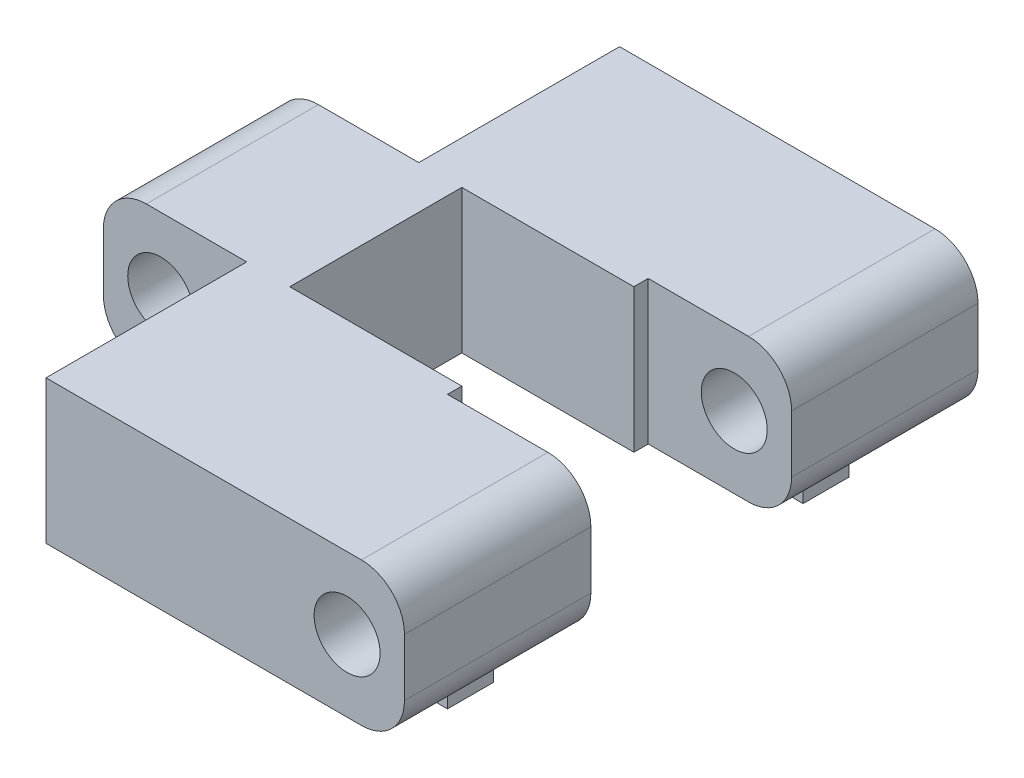
ISO-10303-21;
HEADER;
FILE_DESCRIPTION(('STEP AP214'),'2;1');
FILE_NAME('part.step','',(''),(''),'','','');
FILE_SCHEMA(('AUTOMOTIVE_DESIGN { 1 0 10303 214 1 1 1 1 }'));
ENDSEC;
DATA;
#1=APPLICATION_CONTEXT('core data for automotive mechanical design processes');
#2=APPLICATION_PROTOCOL_DEFINITION('international standard','automotive_design',2000,#1);
#3=PRODUCT_CONTEXT('',#1,'mechanical');
#4=PRODUCT('Part','Part','',(#3));
#5=PRODUCT_RELATED_PRODUCT_CATEGORY('part','',(#4));
#6=PRODUCT_DEFINITION_FORMATION('','',#4);
#7=PRODUCT_DEFINITION_CONTEXT('part definition',#1,'design');
#8=PRODUCT_DEFINITION('design','',#6,#7);
#9=PRODUCT_DEFINITION_SHAPE('','',#8);
#10=(LENGTH_UNIT() NAMED_UNIT(*) SI_UNIT(.MILLI.,.METRE.));
#11=(NAMED_UNIT(*) PLANE_ANGLE_UNIT() SI_UNIT($,.RADIAN.));
#12=(NAMED_UNIT(*) SI_UNIT($,.STERADIAN.) SOLID_ANGLE_UNIT());
#13=UNCERTAINTY_MEASURE_WITH_UNIT(LENGTH_MEASURE(1.E-05),#10,'distance_accuracy_value','');
#14=(GEOMETRIC_REPRESENTATION_CONTEXT(3) GLOBAL_UNCERTAINTY_ASSIGNED_CONTEXT((#13)) GLOBAL_UNIT_ASSIGNED_CONTEXT((#10,
#11,#12)) REPRESENTATION_CONTEXT('',''));
#15=CARTESIAN_POINT('',(0.,0.,0.));
#16=DIRECTION('',(0.,0.,1.));
#17=DIRECTION('',(1.,0.,0.));
#18=AXIS2_PLACEMENT_3D('',#15,#16,#17);
#19=CARTESIAN_POINT('',(0.,0.,0.));
#20=DIRECTION('',(0.,-1.,0.));
#21=DIRECTION('',(0.,0.,-1.));
#22=AXIS2_PLACEMENT_3D('',#19,#20,#21);
#23=PLANE('',#22);
#24=DIRECTION('',(0.,0.,1.));
#25=VECTOR('',#24,1.);
#26=CARTESIAN_POINT('',(-3.75,0.,0.));
#27=LINE('',#26,#25);
#28=CARTESIAN_POINT('',(-3.75,0.,7.));
#29=VERTEX_POINT('',#28);
#30=CARTESIAN_POINT('',(-3.75,0.,10.));
#31=VERTEX_POINT('',#30);
#32=EDGE_CURVE('E49',#29,#31,#27,.T.);
#33=ORIENTED_EDGE('',*,*,#32,.F.);
#34=DIRECTION('',(-1.,0.,0.));
#35=VECTOR('',#34,1.);
#36=CARTESIAN_POINT('',(7.25,0.,7.));
#37=LINE('',#36,#35);
#38=CARTESIAN_POINT('',(7.25,0.,7.));
#39=VERTEX_POINT('',#38);
#40=EDGE_CURVE('E904',#39,#29,#37,.T.);
#41=ORIENTED_EDGE('',*,*,#40,.F.);
#42=DIRECTION('',(0.,0.,-1.));
#43=VECTOR('',#42,1.);
#44=CARTESIAN_POINT('',(7.25,0.,10.));
#45=LINE('',#44,#43);
#46=CARTESIAN_POINT('',(7.25,0.,10.));
#47=VERTEX_POINT('',#46);
#48=EDGE_CURVE('E455',#39,#47,#45,.F.);
#49=ORIENTED_EDGE('',*,*,#48,.T.);
#50=DIRECTION('',(1.,0.,0.));
#51=VECTOR('',#50,1.);
#52=CARTESIAN_POINT('',(-8.75,0.,10.));
#53=LINE('',#52,#51);
#54=EDGE_CURVE('E381',#31,#47,#53,.T.);
#55=ORIENTED_EDGE('',*,*,#54,.F.);
#56=EDGE_LOOP('',(#33,#41,#49,#55));
#57=FACE_BOUND('',#56,.T.);
#58=ADVANCED_FACE('F34',(#57),#23,.T.);
#59=CARTESIAN_POINT('',(7.25,0.,3.5));
#60=VERTEX_POINT('',#59);
#61=CARTESIAN_POINT('',(7.25,0.,5.4));
#62=VERTEX_POINT('',#61);
#63=EDGE_CURVE('E456',#60,#62,#45,.F.);
#64=ORIENTED_EDGE('',*,*,#63,.T.);
#65=DIRECTION('',(1.,0.,0.));
#66=VECTOR('',#65,1.);
#67=CARTESIAN_POINT('',(7.25,0.,5.4));
#68=LINE('',#67,#66);
#69=CARTESIAN_POINT('',(-3.75,0.,5.4));
#70=VERTEX_POINT('',#69);
#71=EDGE_CURVE('E57',#70,#62,#68,.T.);
#72=ORIENTED_EDGE('',*,*,#71,.F.);
#73=CARTESIAN_POINT('',(-3.75,0.,3.));
#74=VERTEX_POINT('',#73);
#75=EDGE_CURVE('E401',#74,#70,#27,.T.);
#76=ORIENTED_EDGE('',*,*,#75,.F.);
#77=DIRECTION('',(1.,0.,0.));
#78=VECTOR('',#77,1.);
#79=CARTESIAN_POINT('',(0.,0.,3.));
#80=LINE('',#79,#78);
#81=CARTESIAN_POINT('',(-7.25,0.,3.));
#82=VERTEX_POINT('',#81);
#83=EDGE_CURVE('E358',#82,#74,#80,.T.);
#84=ORIENTED_EDGE('',*,*,#83,.F.);
#85=DIRECTION('',(0.,0.,1.));
#86=VECTOR('',#85,1.);
#87=CARTESIAN_POINT('',(-7.25,0.,-3.));
#88=LINE('',#87,#86);
#89=CARTESIAN_POINT('',(-7.25,0.,-3.));
#90=VERTEX_POINT('',#89);
#91=EDGE_CURVE('E427',#82,#90,#88,.F.);
#92=ORIENTED_EDGE('',*,*,#91,.T.);
#93=DIRECTION('',(-1.,0.,0.));
#94=VECTOR('',#93,1.);
#95=CARTESIAN_POINT('',(0.,0.,-3.));
#96=LINE('',#95,#94);
#97=CARTESIAN_POINT('',(-3.75,0.,-3.));
#98=VERTEX_POINT('',#97);
#99=EDGE_CURVE('E361',#98,#90,#96,.T.);
#100=ORIENTED_EDGE('',*,*,#99,.F.);
#101=DIRECTION('',(0.,0.,1.));
#102=VECTOR('',#101,1.);
#103=CARTESIAN_POINT('',(-3.75,0.,0.));
#104=LINE('',#103,#102);
#105=CARTESIAN_POINT('',(-3.75,0.,-5.4));
#106=VERTEX_POINT('',#105);
#107=EDGE_CURVE('E403',#106,#98,#104,.T.);
#108=ORIENTED_EDGE('',*,*,#107,.F.);
#109=DIRECTION('',(-1.,0.,0.));
#110=VECTOR('',#109,1.);
#111=CARTESIAN_POINT('',(7.25,0.,-5.4));
#112=LINE('',#111,#110);
#113=CARTESIAN_POINT('',(7.25,0.,-5.4));
#114=VERTEX_POINT('',#113);
#115=EDGE_CURVE('E259',#114,#106,#112,.T.);
#116=ORIENTED_EDGE('',*,*,#115,.F.);
#117=DIRECTION('',(0.,0.,-1.));
#118=VECTOR('',#117,1.);
#119=CARTESIAN_POINT('',(7.25,0.,-3.5));
#120=LINE('',#119,#118);
#121=CARTESIAN_POINT('',(7.25,0.,-3.5));
#122=VERTEX_POINT('',#121);
#123=EDGE_CURVE('E458',#114,#122,#120,.F.);
#124=ORIENTED_EDGE('',*,*,#123,.T.);
#125=DIRECTION('',(1.,0.,0.));
#126=VECTOR('',#125,1.);
#127=CARTESIAN_POINT('',(0.,0.,-3.5));
#128=LINE('',#127,#126);
#129=CARTESIAN_POINT('',(3.75,0.,-3.5));
#130=VERTEX_POINT('',#129);
#131=EDGE_CURVE('E365',#130,#122,#128,.T.);
#132=ORIENTED_EDGE('',*,*,#131,.F.);
#133=DIRECTION('',(0.,0.,-1.));
#134=VECTOR('',#133,1.);
#135=CARTESIAN_POINT('',(3.75000000000001,0.,0.));
#136=LINE('',#135,#134);
#137=CARTESIAN_POINT('',(3.75,0.,-3.));
#138=VERTEX_POINT('',#137);
#139=EDGE_CURVE('E407',#138,#130,#136,.T.);
#140=ORIENTED_EDGE('',*,*,#139,.F.);
#141=DIRECTION('',(1.,0.,0.));
#142=VECTOR('',#141,1.);
#143=CARTESIAN_POINT('',(0.,0.,-3.));
#144=LINE('',#143,#142);
#145=CARTESIAN_POINT('',(-2.25,0.,-3.));
#146=VERTEX_POINT('',#145);
#147=EDGE_CURVE('E410',#146,#138,#144,.T.);
#148=ORIENTED_EDGE('',*,*,#147,.F.);
#149=DIRECTION('',(0.,0.,-1.));
#150=VECTOR('',#149,1.);
#151=CARTESIAN_POINT('',(-2.25,0.,0.));
#152=LINE('',#151,#150);
#153=CARTESIAN_POINT('',(-2.25,0.,3.));
#154=VERTEX_POINT('',#153);
#155=EDGE_CURVE('E412',#154,#146,#152,.T.);
#156=ORIENTED_EDGE('',*,*,#155,.F.);
#157=DIRECTION('',(-1.,0.,0.));
#158=VECTOR('',#157,1.);
#159=CARTESIAN_POINT('',(0.,0.,3.));
#160=LINE('',#159,#158);
#161=CARTESIAN_POINT('',(3.75,0.,3.));
#162=VERTEX_POINT('',#161);
#163=EDGE_CURVE('E414',#162,#154,#160,.T.);
#164=ORIENTED_EDGE('',*,*,#163,.F.);
#165=DIRECTION('',(0.,0.,-1.));
#166=VECTOR('',#165,1.);
#167=CARTESIAN_POINT('',(3.75,0.,0.));
#168=LINE('',#167,#166);
#169=CARTESIAN_POINT('',(3.75,0.,3.5));
#170=VERTEX_POINT('',#169);
#171=EDGE_CURVE('E416',#170,#162,#168,.T.);
#172=ORIENTED_EDGE('',*,*,#171,.F.);
#173=DIRECTION('',(-1.,0.,0.));
#174=VECTOR('',#173,1.);
#175=CARTESIAN_POINT('',(0.,0.,3.5));
#176=LINE('',#175,#174);
#177=EDGE_CURVE('E369',#60,#170,#176,.T.);
#178=ORIENTED_EDGE('',*,*,#177,.F.);
#179=EDGE_LOOP('',(#64,#72,#76,#84,#92,#100,#108,#116,#124,#132,#140,#148,#156,#164,#172,#178));
#180=FACE_BOUND('',#179,.T.);
#181=ADVANCED_FACE('F499',(#180),#23,.T.);
#182=CARTESIAN_POINT('',(7.25,0.,-10.));
#183=VERTEX_POINT('',#182);
#184=CARTESIAN_POINT('',(7.25,0.,-7.));
#185=VERTEX_POINT('',#184);
#186=EDGE_CURVE('E459',#183,#185,#120,.F.);
#187=ORIENTED_EDGE('',*,*,#186,.T.);
#188=DIRECTION('',(1.,0.,0.));
#189=VECTOR('',#188,1.);
#190=CARTESIAN_POINT('',(7.25,0.,-7.));
#191=LINE('',#190,#189);
#192=CARTESIAN_POINT('',(-3.75,0.,-7.));
#193=VERTEX_POINT('',#192);
#194=EDGE_CURVE('E269',#193,#185,#191,.T.);
#195=ORIENTED_EDGE('',*,*,#194,.F.);
#196=CARTESIAN_POINT('',(-3.75,0.,-9.99999999999999));
#197=VERTEX_POINT('',#196);
#198=EDGE_CURVE('E404',#197,#193,#104,.T.);
#199=ORIENTED_EDGE('',*,*,#198,.F.);
#200=DIRECTION('',(-1.,0.,0.));
#201=VECTOR('',#200,1.);
#202=CARTESIAN_POINT('',(-8.75,0.,-10.));
#203=LINE('',#202,#201);
#204=EDGE_CURVE('E377',#183,#197,#203,.T.);
#205=ORIENTED_EDGE('',*,*,#204,.F.);
#206=EDGE_LOOP('',(#187,#195,#199,#205));
#207=FACE_BOUND('',#206,.T.);
#208=ADVANCED_FACE('F545',(#207),#23,.T.);
#209=CARTESIAN_POINT('',(8.75,5.,10.));
#210=DIRECTION('',(-1.,0.,0.));
#211=DIRECTION('',(0.,0.,1.));
#212=AXIS2_PLACEMENT_3D('',#209,#210,#211);
#213=PLANE('',#212);
#214=DIRECTION('',(0.,-1.,0.));
#215=VECTOR('',#214,1.);
#216=CARTESIAN_POINT('',(8.75,5.,10.));
#217=LINE('',#216,#215);
#218=CARTESIAN_POINT('',(8.75,3.5,10.));
#219=VERTEX_POINT('',#218);
#220=CARTESIAN_POINT('',(8.75,1.5,10.));
#221=VERTEX_POINT('',#220);
#222=EDGE_CURVE('E384',#219,#221,#217,.T.);
#223=ORIENTED_EDGE('',*,*,#222,.T.);
#224=DIRECTION('',(0.,0.,-1.));
#225=VECTOR('',#224,1.);
#226=CARTESIAN_POINT('',(8.75,1.5,3.5));
#227=LINE('',#226,#225);
#228=CARTESIAN_POINT('',(8.75,1.5,3.5));
#229=VERTEX_POINT('',#228);
#230=EDGE_CURVE('E464',#221,#229,#227,.T.);
#231=ORIENTED_EDGE('',*,*,#230,.T.);
#232=DIRECTION('',(0.,1.,0.));
#233=VECTOR('',#232,1.);
#234=CARTESIAN_POINT('',(8.75,-15.,3.5));
#235=LINE('',#234,#233);
#236=CARTESIAN_POINT('',(8.75,3.5,3.5));
#237=VERTEX_POINT('',#236);
#238=EDGE_CURVE('E314',#229,#237,#235,.T.);
#239=ORIENTED_EDGE('',*,*,#238,.T.);
#240=DIRECTION('',(0.,0.,-1.));
#241=VECTOR('',#240,1.);
#242=CARTESIAN_POINT('',(8.75,3.5,10.));
#243=LINE('',#242,#241);
#244=EDGE_CURVE('E462',#237,#219,#243,.F.);
#245=ORIENTED_EDGE('',*,*,#244,.T.);
#246=EDGE_LOOP('',(#223,#231,#239,#245));
#247=FACE_BOUND('',#246,.T.);
#248=ADVANCED_FACE('F490',(#247),#213,.F.);
#249=CARTESIAN_POINT('',(6.75,2.5,-40.));
#250=DIRECTION('',(0.,0.,1.));
#251=DIRECTION('',(1.,0.,0.));
#252=AXIS2_PLACEMENT_3D('',#249,#250,#251);
#253=CYLINDRICAL_SURFACE('',#252,1.15);
#254=CARTESIAN_POINT('',(6.75,2.5,3.5));
#255=DIRECTION('',(0.,0.,1.));
#256=DIRECTION('',(1.,0.,0.));
#257=AXIS2_PLACEMENT_3D('',#254,#255,#256);
#258=CIRCLE('',#257,1.15);
#259=CARTESIAN_POINT('',(7.9,2.5,3.5));
#260=VERTEX_POINT('',#259);
#261=EDGE_CURVE('E368',#260,#260,#258,.F.);
#262=ORIENTED_EDGE('',*,*,#261,.T.);
#263=EDGE_LOOP('',(#262));
#264=FACE_BOUND('',#263,.T.);
#265=CARTESIAN_POINT('',(6.75,2.5,10.));
#266=DIRECTION('',(0.,0.,1.));
#267=DIRECTION('',(1.,0.,0.));
#268=AXIS2_PLACEMENT_3D('',#265,#266,#267);
#269=CIRCLE('',#268,1.15);
#270=CARTESIAN_POINT('',(7.9,2.5,10.));
#271=VERTEX_POINT('',#270);
#272=EDGE_CURVE('E371',#271,#271,#269,.T.);
#273=ORIENTED_EDGE('',*,*,#272,.T.);
#274=EDGE_LOOP('',(#273));
#275=FACE_BOUND('',#274,.T.);
#276=ADVANCED_FACE('F608',(#264,#275),#253,.F.);
#277=DIRECTION('',(0.,-1.,0.));
#278=VECTOR('',#277,1.);
#279=CARTESIAN_POINT('',(8.75,5.,-10.));
#280=LINE('',#279,#278);
#281=CARTESIAN_POINT('',(8.75,3.5,-10.));
#282=VERTEX_POINT('',#281);
#283=CARTESIAN_POINT('',(8.75,1.5,-10.));
#284=VERTEX_POINT('',#283);
#285=EDGE_CURVE('E390',#282,#284,#280,.T.);
#286=ORIENTED_EDGE('',*,*,#285,.F.);
#287=DIRECTION('',(0.,0.,-1.));
#288=VECTOR('',#287,1.);
#289=CARTESIAN_POINT('',(8.75,3.5,10.));
#290=LINE('',#289,#288);
#291=CARTESIAN_POINT('',(8.75,3.5,-3.5));
#292=VERTEX_POINT('',#291);
#293=EDGE_CURVE('E449',#282,#292,#290,.F.);
#294=ORIENTED_EDGE('',*,*,#293,.T.);
#295=DIRECTION('',(0.,1.,0.));
#296=VECTOR('',#295,1.);
#297=CARTESIAN_POINT('',(8.75,-15.,-3.5));
#298=LINE('',#297,#296);
#299=CARTESIAN_POINT('',(8.75,1.5,-3.5));
#300=VERTEX_POINT('',#299);
#301=EDGE_CURVE('E313',#300,#292,#298,.T.);
#302=ORIENTED_EDGE('',*,*,#301,.F.);
#303=DIRECTION('',(0.,0.,-1.));
#304=VECTOR('',#303,1.);
#305=CARTESIAN_POINT('',(8.75,1.5,-10.));
#306=LINE('',#305,#304);
#307=EDGE_CURVE('E446',#300,#284,#306,.T.);
#308=ORIENTED_EDGE('',*,*,#307,.T.);
#309=EDGE_LOOP('',(#286,#294,#302,#308));
#310=FACE_BOUND('',#309,.T.);
#311=ADVANCED_FACE('F534',(#310),#213,.F.);
#312=CARTESIAN_POINT('',(-8.75,5.,-10.));
#313=DIRECTION('',(0.,0.,1.));
#314=DIRECTION('',(1.,0.,0.));
#315=AXIS2_PLACEMENT_3D('',#312,#313,#314);
#316=PLANE('',#315);
#317=CARTESIAN_POINT('',(6.75,2.5,-10.));
#318=DIRECTION('',(0.,0.,1.));
#319=DIRECTION('',(1.,0.,0.));
#320=AXIS2_PLACEMENT_3D('',#317,#318,#319);
#321=CIRCLE('',#320,1.15);
#322=CARTESIAN_POINT('',(7.9,2.5,-10.));
#323=VERTEX_POINT('',#322);
#324=EDGE_CURVE('E374',#323,#323,#321,.T.);
#325=ORIENTED_EDGE('',*,*,#324,.T.);
#326=EDGE_LOOP('',(#325));
#327=FACE_BOUND('',#326,.T.);
#328=DIRECTION('',(-1.,0.,0.));
#329=VECTOR('',#328,1.);
#330=CARTESIAN_POINT('',(-8.75,5.,-10.));
#331=LINE('',#330,#329);
#332=CARTESIAN_POINT('',(7.25,5.,-10.));
#333=VERTEX_POINT('',#332);
#334=CARTESIAN_POINT('',(-3.75,5.,-9.99999999999999));
#335=VERTEX_POINT('',#334);
#336=EDGE_CURVE('E378',#333,#335,#331,.T.);
#337=ORIENTED_EDGE('',*,*,#336,.F.);
#338=CARTESIAN_POINT('',(7.25,3.5,-10.));
#339=DIRECTION('',(0.,0.,1.));
#340=DIRECTION('',(1.,0.,0.));
#341=AXIS2_PLACEMENT_3D('',#338,#339,#340);
#342=CIRCLE('',#341,1.5);
#343=EDGE_CURVE('E444',#333,#282,#342,.F.);
#344=ORIENTED_EDGE('',*,*,#343,.T.);
#345=ORIENTED_EDGE('',*,*,#285,.T.);
#346=CARTESIAN_POINT('',(7.25,1.5,-10.));
#347=DIRECTION('',(0.,0.,1.));
#348=DIRECTION('',(1.,0.,0.));
#349=AXIS2_PLACEMENT_3D('',#346,#347,#348);
#350=CIRCLE('',#349,1.5);
#351=EDGE_CURVE('E442',#284,#183,#350,.F.);
#352=ORIENTED_EDGE('',*,*,#351,.T.);
#353=ORIENTED_EDGE('',*,*,#204,.T.);
#354=DIRECTION('',(0.,1.,0.));
#355=VECTOR('',#354,1.);
#356=CARTESIAN_POINT('',(-3.75,-15.,-9.99999999999999));
#357=LINE('',#356,#355);
#358=EDGE_CURVE('E295',#197,#335,#357,.T.);
#359=ORIENTED_EDGE('',*,*,#358,.T.);
#360=EDGE_LOOP('',(#337,#344,#345,#352,#353,#359));
#361=FACE_BOUND('',#360,.T.);
#362=ADVANCED_FACE('F532',(#327,#361),#316,.F.);
#363=CARTESIAN_POINT('',(-8.75,5.,10.));
#364=DIRECTION('',(1.,0.,0.));
#365=DIRECTION('',(0.,0.,-1.));
#366=AXIS2_PLACEMENT_3D('',#363,#364,#365);
#367=PLANE('',#366);
#368=DIRECTION('',(0.,1.,0.));
#369=VECTOR('',#368,1.);
#370=CARTESIAN_POINT('',(-8.75,-15.,-3.));
#371=LINE('',#370,#369);
#372=CARTESIAN_POINT('',(-8.75,1.5,-3.));
#373=VERTEX_POINT('',#372);
#374=CARTESIAN_POINT('',(-8.75,3.5,-3.));
#375=VERTEX_POINT('',#374);
#376=EDGE_CURVE('E339',#373,#375,#371,.T.);
#377=ORIENTED_EDGE('',*,*,#376,.F.);
#378=DIRECTION('',(0.,0.,1.));
#379=VECTOR('',#378,1.);
#380=CARTESIAN_POINT('',(-8.75,1.5,3.));
#381=LINE('',#380,#379);
#382=CARTESIAN_POINT('',(-8.75,1.5,3.));
#383=VERTEX_POINT('',#382);
#384=EDGE_CURVE('E420',#373,#383,#381,.T.);
#385=ORIENTED_EDGE('',*,*,#384,.T.);
#386=DIRECTION('',(0.,1.,0.));
#387=VECTOR('',#386,1.);
#388=CARTESIAN_POINT('',(-8.75,-15.,3.));
#389=LINE('',#388,#387);
#390=CARTESIAN_POINT('',(-8.75,3.5,3.));
#391=VERTEX_POINT('',#390);
#392=EDGE_CURVE('E336',#383,#391,#389,.T.);
#393=ORIENTED_EDGE('',*,*,#392,.T.);
#394=DIRECTION('',(0.,0.,1.));
#395=VECTOR('',#394,1.);
#396=CARTESIAN_POINT('',(-8.75,3.5,10.));
#397=LINE('',#396,#395);
#398=EDGE_CURVE('E418',#391,#375,#397,.F.);
#399=ORIENTED_EDGE('',*,*,#398,.T.);
#400=EDGE_LOOP('',(#377,#385,#393,#399));
#401=FACE_BOUND('',#400,.T.);
#402=ADVANCED_FACE('F577',(#401),#367,.F.);
#403=CARTESIAN_POINT('',(-8.75,5.,10.));
#404=DIRECTION('',(0.,0.,-1.));
#405=DIRECTION('',(-1.,0.,0.));
#406=AXIS2_PLACEMENT_3D('',#403,#404,#405);
#407=PLANE('',#406);
#408=ORIENTED_EDGE('',*,*,#272,.F.);
#409=EDGE_LOOP('',(#408));
#410=FACE_BOUND('',#409,.T.);
#411=ORIENTED_EDGE('',*,*,#54,.T.);
#412=CARTESIAN_POINT('',(7.25,1.5,10.));
#413=DIRECTION('',(0.,0.,-1.));
#414=DIRECTION('',(-1.,0.,0.));
#415=AXIS2_PLACEMENT_3D('',#412,#413,#414);
#416=CIRCLE('',#415,1.5);
#417=EDGE_CURVE('E11',#47,#221,#416,.F.);
#418=ORIENTED_EDGE('',*,*,#417,.T.);
#419=ORIENTED_EDGE('',*,*,#222,.F.);
#420=CARTESIAN_POINT('',(7.25,3.5,10.));
#421=DIRECTION('',(0.,0.,-1.));
#422=DIRECTION('',(-1.,0.,0.));
#423=AXIS2_PLACEMENT_3D('',#420,#421,#422);
#424=CIRCLE('',#423,1.5);
#425=CARTESIAN_POINT('',(7.25,5.,10.));
#426=VERTEX_POINT('',#425);
#427=EDGE_CURVE('E42',#219,#426,#424,.F.);
#428=ORIENTED_EDGE('',*,*,#427,.T.);
#429=DIRECTION('',(1.,0.,0.));
#430=VECTOR('',#429,1.);
#431=CARTESIAN_POINT('',(-8.75,5.,10.));
#432=LINE('',#431,#430);
#433=CARTESIAN_POINT('',(-3.75,5.,10.));
#434=VERTEX_POINT('',#433);
#435=EDGE_CURVE('E380',#434,#426,#432,.T.);
#436=ORIENTED_EDGE('',*,*,#435,.F.);
#437=DIRECTION('',(0.,1.,0.));
#438=VECTOR('',#437,1.);
#439=CARTESIAN_POINT('',(-3.75,-15.,10.));
#440=LINE('',#439,#438);
#441=EDGE_CURVE('E352',#31,#434,#440,.T.);
#442=ORIENTED_EDGE('',*,*,#441,.F.);
#443=EDGE_LOOP('',(#411,#418,#419,#428,#436,#442));
#444=FACE_BOUND('',#443,.T.);
#445=ADVANCED_FACE('F474',(#410,#444),#407,.F.);
#446=CARTESIAN_POINT('',(0.,5.,0.));
#447=DIRECTION('',(0.,-1.,0.));
#448=DIRECTION('',(0.,0.,-1.));
#449=AXIS2_PLACEMENT_3D('',#446,#447,#448);
#450=PLANE('',#449);
#451=DIRECTION('',(-1.,0.,0.));
#452=VECTOR('',#451,1.);
#453=CARTESIAN_POINT('',(8.75,5.,-3.5));
#454=LINE('',#453,#452);
#455=CARTESIAN_POINT('',(7.25,5.,-3.5));
#456=VERTEX_POINT('',#455);
#457=CARTESIAN_POINT('',(3.75,5.,-3.5));
#458=VERTEX_POINT('',#457);
#459=EDGE_CURVE('E292',#456,#458,#454,.T.);
#460=ORIENTED_EDGE('',*,*,#459,.F.);
#461=DIRECTION('',(0.,0.,-1.));
#462=VECTOR('',#461,1.);
#463=CARTESIAN_POINT('',(7.25,5.,0.));
#464=LINE('',#463,#462);
#465=EDGE_CURVE('E439',#456,#333,#464,.T.);
#466=ORIENTED_EDGE('',*,*,#465,.T.);
#467=ORIENTED_EDGE('',*,*,#336,.T.);
#468=DIRECTION('',(0.,0.,-1.));
#469=VECTOR('',#468,1.);
#470=CARTESIAN_POINT('',(-3.75,5.,-9.99999999999999));
#471=LINE('',#470,#469);
#472=CARTESIAN_POINT('',(-3.75,5.,-3.));
#473=VERTEX_POINT('',#472);
#474=EDGE_CURVE('E335',#473,#335,#471,.T.);
#475=ORIENTED_EDGE('',*,*,#474,.F.);
#476=DIRECTION('',(1.,0.,0.));
#477=VECTOR('',#476,1.);
#478=CARTESIAN_POINT('',(-8.75,5.,-3.));
#479=LINE('',#478,#477);
#480=CARTESIAN_POINT('',(-7.25,5.,-3.));
#481=VERTEX_POINT('',#480);
#482=EDGE_CURVE('E333',#481,#473,#479,.T.);
#483=ORIENTED_EDGE('',*,*,#482,.F.);
#484=DIRECTION('',(0.,0.,1.));
#485=VECTOR('',#484,1.);
#486=CARTESIAN_POINT('',(-7.25,5.,0.));
#487=LINE('',#486,#485);
#488=CARTESIAN_POINT('',(-7.25,5.,3.));
#489=VERTEX_POINT('',#488);
#490=EDGE_CURVE('E433',#481,#489,#487,.T.);
#491=ORIENTED_EDGE('',*,*,#490,.T.);
#492=DIRECTION('',(-1.,0.,0.));
#493=VECTOR('',#492,1.);
#494=CARTESIAN_POINT('',(-8.75,5.,3.));
#495=LINE('',#494,#493);
#496=CARTESIAN_POINT('',(-3.75,5.,3.));
#497=VERTEX_POINT('',#496);
#498=EDGE_CURVE('E349',#497,#489,#495,.T.);
#499=ORIENTED_EDGE('',*,*,#498,.F.);
#500=DIRECTION('',(0.,0.,-1.));
#501=VECTOR('',#500,1.);
#502=CARTESIAN_POINT('',(-3.75,5.,10.));
#503=LINE('',#502,#501);
#504=EDGE_CURVE('E291',#434,#497,#503,.T.);
#505=ORIENTED_EDGE('',*,*,#504,.F.);
#506=ORIENTED_EDGE('',*,*,#435,.T.);
#507=DIRECTION('',(0.,0.,-1.));
#508=VECTOR('',#507,1.);
#509=CARTESIAN_POINT('',(7.25,5.,0.));
#510=LINE('',#509,#508);
#511=CARTESIAN_POINT('',(7.25,5.,3.5));
#512=VERTEX_POINT('',#511);
#513=EDGE_CURVE('E436',#426,#512,#510,.T.);
#514=ORIENTED_EDGE('',*,*,#513,.T.);
#515=DIRECTION('',(1.,0.,0.));
#516=VECTOR('',#515,1.);
#517=CARTESIAN_POINT('',(8.75,5.,3.5));
#518=LINE('',#517,#516);
#519=CARTESIAN_POINT('',(3.75,5.,3.5));
#520=VERTEX_POINT('',#519);
#521=EDGE_CURVE('E310',#520,#512,#518,.T.);
#522=ORIENTED_EDGE('',*,*,#521,.F.);
#523=DIRECTION('',(0.,0.,1.));
#524=VECTOR('',#523,1.);
#525=CARTESIAN_POINT('',(3.75,5.,3.5));
#526=LINE('',#525,#524);
#527=CARTESIAN_POINT('',(3.75,5.,3.));
#528=VERTEX_POINT('',#527);
#529=EDGE_CURVE('E307',#528,#520,#526,.T.);
#530=ORIENTED_EDGE('',*,*,#529,.F.);
#531=DIRECTION('',(1.,0.,0.));
#532=VECTOR('',#531,1.);
#533=CARTESIAN_POINT('',(3.75,5.,3.));
#534=LINE('',#533,#532);
#535=CARTESIAN_POINT('',(-2.25,5.,3.));
#536=VERTEX_POINT('',#535);
#537=EDGE_CURVE('E304',#536,#528,#534,.T.);
#538=ORIENTED_EDGE('',*,*,#537,.F.);
#539=DIRECTION('',(0.,0.,1.));
#540=VECTOR('',#539,1.);
#541=CARTESIAN_POINT('',(-2.25,5.,-3.));
#542=LINE('',#541,#540);
#543=CARTESIAN_POINT('',(-2.25,5.,-3.));
#544=VERTEX_POINT('',#543);
#545=EDGE_CURVE('E301',#544,#536,#542,.T.);
#546=ORIENTED_EDGE('',*,*,#545,.F.);
#547=DIRECTION('',(-1.,0.,0.));
#548=VECTOR('',#547,1.);
#549=CARTESIAN_POINT('',(3.75,5.,-3.));
#550=LINE('',#549,#548);
#551=CARTESIAN_POINT('',(3.75,5.,-3.));
#552=VERTEX_POINT('',#551);
#553=EDGE_CURVE('E298',#552,#544,#550,.T.);
#554=ORIENTED_EDGE('',*,*,#553,.F.);
#555=DIRECTION('',(0.,0.,1.));
#556=VECTOR('',#555,1.);
#557=CARTESIAN_POINT('',(3.75,5.,-3.5));
#558=LINE('',#557,#556);
#559=EDGE_CURVE('E294',#458,#552,#558,.T.);
#560=ORIENTED_EDGE('',*,*,#559,.F.);
#561=EDGE_LOOP('',(#460,#466,#467,#475,#483,#491,#499,#505,#506,#514,#522,#530,#538,#546,#554,#560));
#562=FACE_BOUND('',#561,.T.);
#563=ADVANCED_FACE('F482',(#562),#450,.F.);
#564=CARTESIAN_POINT('',(6.75,2.5,-3.5));
#565=DIRECTION('',(0.,0.,-1.));
#566=DIRECTION('',(-1.,0.,0.));
#567=AXIS2_PLACEMENT_3D('',#564,#565,#566);
#568=CIRCLE('',#567,1.15);
#569=CARTESIAN_POINT('',(5.6,2.5,-3.5));
#570=VERTEX_POINT('',#569);
#571=EDGE_CURVE('E364',#570,#570,#568,.F.);
#572=ORIENTED_EDGE('',*,*,#571,.T.);
#573=EDGE_LOOP('',(#572));
#574=FACE_BOUND('',#573,.T.);
#575=ORIENTED_EDGE('',*,*,#324,.F.);
#576=EDGE_LOOP('',(#575));
#577=FACE_BOUND('',#576,.T.);
#578=ADVANCED_FACE('F615',(#574,#577),#253,.F.);
#579=CARTESIAN_POINT('',(-8.75,-15.,3.));
#580=DIRECTION('',(0.,0.,-1.));
#581=DIRECTION('',(-1.,0.,0.));
#582=AXIS2_PLACEMENT_3D('',#579,#580,#581);
#583=PLANE('',#582);
#584=ORIENTED_EDGE('',*,*,#392,.F.);
#585=CARTESIAN_POINT('',(-7.25,1.5,3.));
#586=DIRECTION('',(0.,0.,-1.));
#587=DIRECTION('',(-1.,0.,0.));
#588=AXIS2_PLACEMENT_3D('',#585,#586,#587);
#589=CIRCLE('',#588,1.5);
#590=EDGE_CURVE('E425',#383,#82,#589,.F.);
#591=ORIENTED_EDGE('',*,*,#590,.T.);
#592=ORIENTED_EDGE('',*,*,#83,.T.);
#593=DIRECTION('',(0.,1.,0.));
#594=VECTOR('',#593,1.);
#595=CARTESIAN_POINT('',(-3.75,-15.,3.));
#596=LINE('',#595,#594);
#597=EDGE_CURVE('E355',#74,#497,#596,.T.);
#598=ORIENTED_EDGE('',*,*,#597,.T.);
#599=ORIENTED_EDGE('',*,*,#498,.T.);
#600=CARTESIAN_POINT('',(-7.25,3.5,3.));
#601=DIRECTION('',(0.,0.,-1.));
#602=DIRECTION('',(-1.,0.,0.));
#603=AXIS2_PLACEMENT_3D('',#600,#601,#602);
#604=CIRCLE('',#603,1.5);
#605=EDGE_CURVE('E423',#489,#391,#604,.F.);
#606=ORIENTED_EDGE('',*,*,#605,.T.);
#607=EDGE_LOOP('',(#584,#591,#592,#598,#599,#606));
#608=FACE_BOUND('',#607,.T.);
#609=CARTESIAN_POINT('',(-6.75,2.5,3.));
#610=DIRECTION('',(0.,0.,-1.));
#611=DIRECTION('',(-1.,0.,0.));
#612=AXIS2_PLACEMENT_3D('',#609,#610,#611);
#613=CIRCLE('',#612,1.15);
#614=CARTESIAN_POINT('',(-7.9,2.5,3.));
#615=VERTEX_POINT('',#614);
#616=EDGE_CURVE('E317',#615,#615,#613,.F.);
#617=ORIENTED_EDGE('',*,*,#616,.F.);
#618=EDGE_LOOP('',(#617));
#619=FACE_BOUND('',#618,.T.);
#620=ADVANCED_FACE('F580',(#608,#619),#583,.F.);
#621=CARTESIAN_POINT('',(-3.75,-15.,10.));
#622=DIRECTION('',(1.,0.,0.));
#623=DIRECTION('',(0.,0.,-1.));
#624=AXIS2_PLACEMENT_3D('',#621,#622,#623);
#625=PLANE('',#624);
#626=ORIENTED_EDGE('',*,*,#75,.T.);
#627=DIRECTION('',(0.,1.,0.));
#628=VECTOR('',#627,1.);
#629=CARTESIAN_POINT('',(-3.75,-1.,5.4));
#630=LINE('',#629,#628);
#631=CARTESIAN_POINT('',(-3.75,-1.,5.4));
#632=VERTEX_POINT('',#631);
#633=EDGE_CURVE('E261',#632,#70,#630,.T.);
#634=ORIENTED_EDGE('',*,*,#633,.F.);
#635=DIRECTION('',(0.,0.,-1.));
#636=VECTOR('',#635,1.);
#637=CARTESIAN_POINT('',(-3.75,-1.,5.4));
#638=LINE('',#637,#636);
#639=CARTESIAN_POINT('',(-3.75,-1.,7.));
#640=VERTEX_POINT('',#639);
#641=EDGE_CURVE('E243',#640,#632,#638,.T.);
#642=ORIENTED_EDGE('',*,*,#641,.F.);
#643=DIRECTION('',(0.,1.,0.));
#644=VECTOR('',#643,1.);
#645=CARTESIAN_POINT('',(-3.75,-1.,7.));
#646=LINE('',#645,#644);
#647=EDGE_CURVE('E240',#640,#29,#646,.T.);
#648=ORIENTED_EDGE('',*,*,#647,.T.);
#649=ORIENTED_EDGE('',*,*,#32,.T.);
#650=ORIENTED_EDGE('',*,*,#441,.T.);
#651=ORIENTED_EDGE('',*,*,#504,.T.);
#652=ORIENTED_EDGE('',*,*,#597,.F.);
#653=EDGE_LOOP('',(#626,#634,#642,#648,#649,#650,#651,#652));
#654=FACE_BOUND('',#653,.T.);
#655=ADVANCED_FACE('F641',(#654),#625,.F.);
#656=CARTESIAN_POINT('',(-8.75,-15.,-3.));
#657=DIRECTION('',(0.,0.,1.));
#658=DIRECTION('',(1.,0.,0.));
#659=AXIS2_PLACEMENT_3D('',#656,#657,#658);
#660=PLANE('',#659);
#661=ORIENTED_EDGE('',*,*,#99,.T.);
#662=CARTESIAN_POINT('',(-7.25,1.5,-3.));
#663=DIRECTION('',(0.,0.,1.));
#664=DIRECTION('',(1.,0.,0.));
#665=AXIS2_PLACEMENT_3D('',#662,#663,#664);
#666=CIRCLE('',#665,1.5);
#667=EDGE_CURVE('E431',#90,#373,#666,.F.);
#668=ORIENTED_EDGE('',*,*,#667,.T.);
#669=ORIENTED_EDGE('',*,*,#376,.T.);
#670=CARTESIAN_POINT('',(-7.25,3.5,-3.));
#671=DIRECTION('',(0.,0.,1.));
#672=DIRECTION('',(1.,0.,0.));
#673=AXIS2_PLACEMENT_3D('',#670,#671,#672);
#674=CIRCLE('',#673,1.5);
#675=EDGE_CURVE('E429',#375,#481,#674,.F.);
#676=ORIENTED_EDGE('',*,*,#675,.T.);
#677=ORIENTED_EDGE('',*,*,#482,.T.);
#678=DIRECTION('',(0.,1.,0.));
#679=VECTOR('',#678,1.);
#680=CARTESIAN_POINT('',(-3.75,-15.,-3.));
#681=LINE('',#680,#679);
#682=EDGE_CURVE('E342',#98,#473,#681,.T.);
#683=ORIENTED_EDGE('',*,*,#682,.F.);
#684=EDGE_LOOP('',(#661,#668,#669,#676,#677,#683));
#685=FACE_BOUND('',#684,.T.);
#686=CARTESIAN_POINT('',(-6.75,2.5,-3.));
#687=DIRECTION('',(0.,0.,1.));
#688=DIRECTION('',(1.,0.,0.));
#689=AXIS2_PLACEMENT_3D('',#686,#687,#688);
#690=CIRCLE('',#689,1.15);
#691=CARTESIAN_POINT('',(-5.6,2.5,-3.));
#692=VERTEX_POINT('',#691);
#693=EDGE_CURVE('E360',#692,#692,#690,.F.);
#694=ORIENTED_EDGE('',*,*,#693,.F.);
#695=EDGE_LOOP('',(#694));
#696=FACE_BOUND('',#695,.T.);
#697=ADVANCED_FACE('F569',(#685,#696),#660,.F.);
#698=CARTESIAN_POINT('',(-3.75,-15.,-9.99999999999999));
#699=DIRECTION('',(1.,0.,0.));
#700=DIRECTION('',(0.,0.,-1.));
#701=AXIS2_PLACEMENT_3D('',#698,#699,#700);
#702=PLANE('',#701);
#703=ORIENTED_EDGE('',*,*,#198,.T.);
#704=DIRECTION('',(0.,1.,0.));
#705=VECTOR('',#704,1.);
#706=CARTESIAN_POINT('',(-3.75,-1.,-7.));
#707=LINE('',#706,#705);
#708=CARTESIAN_POINT('',(-3.75,-1.,-7.));
#709=VERTEX_POINT('',#708);
#710=EDGE_CURVE('E282',#709,#193,#707,.T.);
#711=ORIENTED_EDGE('',*,*,#710,.F.);
#712=DIRECTION('',(0.,0.,-1.));
#713=VECTOR('',#712,1.);
#714=CARTESIAN_POINT('',(-3.75,-1.,-7.));
#715=LINE('',#714,#713);
#716=CARTESIAN_POINT('',(-3.75,-1.,-5.4));
#717=VERTEX_POINT('',#716);
#718=EDGE_CURVE('E271',#717,#709,#715,.T.);
#719=ORIENTED_EDGE('',*,*,#718,.F.);
#720=DIRECTION('',(0.,1.,0.));
#721=VECTOR('',#720,1.);
#722=CARTESIAN_POINT('',(-3.75,-1.,-5.4));
#723=LINE('',#722,#721);
#724=EDGE_CURVE('E285',#717,#106,#723,.T.);
#725=ORIENTED_EDGE('',*,*,#724,.T.);
#726=ORIENTED_EDGE('',*,*,#107,.T.);
#727=ORIENTED_EDGE('',*,*,#682,.T.);
#728=ORIENTED_EDGE('',*,*,#474,.T.);
#729=ORIENTED_EDGE('',*,*,#358,.F.);
#730=EDGE_LOOP('',(#703,#711,#719,#725,#726,#727,#728,#729));
#731=FACE_BOUND('',#730,.T.);
#732=ADVANCED_FACE('F548',(#731),#702,.F.);
#733=CARTESIAN_POINT('',(8.75,-15.,3.5));
#734=DIRECTION('',(0.,0.,1.));
#735=DIRECTION('',(1.,0.,0.));
#736=AXIS2_PLACEMENT_3D('',#733,#734,#735);
#737=PLANE('',#736);
#738=ORIENTED_EDGE('',*,*,#238,.F.);
#739=CARTESIAN_POINT('',(7.25,1.5,3.5));
#740=DIRECTION('',(0.,0.,1.));
#741=DIRECTION('',(1.,0.,0.));
#742=AXIS2_PLACEMENT_3D('',#739,#740,#741);
#743=CIRCLE('',#742,1.5);
#744=EDGE_CURVE('E469',#229,#60,#743,.F.);
#745=ORIENTED_EDGE('',*,*,#744,.T.);
#746=ORIENTED_EDGE('',*,*,#177,.T.);
#747=DIRECTION('',(0.,1.,0.));
#748=VECTOR('',#747,1.);
#749=CARTESIAN_POINT('',(3.75,-15.,3.5));
#750=LINE('',#749,#748);
#751=EDGE_CURVE('E318',#170,#520,#750,.T.);
#752=ORIENTED_EDGE('',*,*,#751,.T.);
#753=ORIENTED_EDGE('',*,*,#521,.T.);
#754=CARTESIAN_POINT('',(7.25,3.5,3.5));
#755=DIRECTION('',(0.,0.,1.));
#756=DIRECTION('',(1.,0.,0.));
#757=AXIS2_PLACEMENT_3D('',#754,#755,#756);
#758=CIRCLE('',#757,1.5);
#759=EDGE_CURVE('E467',#512,#237,#758,.F.);
#760=ORIENTED_EDGE('',*,*,#759,.T.);
#761=EDGE_LOOP('',(#738,#745,#746,#752,#753,#760));
#762=FACE_BOUND('',#761,.T.);
#763=ORIENTED_EDGE('',*,*,#261,.F.);
#764=EDGE_LOOP('',(#763));
#765=FACE_BOUND('',#764,.T.);
#766=ADVANCED_FACE('F487',(#762,#765),#737,.F.);
#767=CARTESIAN_POINT('',(8.75,-15.,-3.5));
#768=DIRECTION('',(0.,0.,-1.));
#769=DIRECTION('',(-1.,0.,0.));
#770=AXIS2_PLACEMENT_3D('',#767,#768,#769);
#771=PLANE('',#770);
#772=ORIENTED_EDGE('',*,*,#301,.T.);
#773=CARTESIAN_POINT('',(7.25,3.5,-3.5));
#774=DIRECTION('',(0.,0.,-1.));
#775=DIRECTION('',(-1.,0.,0.));
#776=AXIS2_PLACEMENT_3D('',#773,#774,#775);
#777=CIRCLE('',#776,1.5);
#778=EDGE_CURVE('E453',#292,#456,#777,.F.);
#779=ORIENTED_EDGE('',*,*,#778,.T.);
#780=ORIENTED_EDGE('',*,*,#459,.T.);
#781=DIRECTION('',(0.,1.,0.));
#782=VECTOR('',#781,1.);
#783=CARTESIAN_POINT('',(3.75,-15.,-3.5));
#784=LINE('',#783,#782);
#785=EDGE_CURVE('E328',#130,#458,#784,.T.);
#786=ORIENTED_EDGE('',*,*,#785,.F.);
#787=ORIENTED_EDGE('',*,*,#131,.T.);
#788=CARTESIAN_POINT('',(7.25,1.5,-3.5));
#789=DIRECTION('',(0.,0.,-1.));
#790=DIRECTION('',(-1.,0.,0.));
#791=AXIS2_PLACEMENT_3D('',#788,#789,#790);
#792=CIRCLE('',#791,1.5);
#793=EDGE_CURVE('E451',#122,#300,#792,.F.);
#794=ORIENTED_EDGE('',*,*,#793,.T.);
#795=EDGE_LOOP('',(#772,#779,#780,#786,#787,#794));
#796=FACE_BOUND('',#795,.T.);
#797=ORIENTED_EDGE('',*,*,#571,.F.);
#798=EDGE_LOOP('',(#797));
#799=FACE_BOUND('',#798,.T.);
#800=ADVANCED_FACE('F651',(#796,#799),#771,.F.);
#801=CARTESIAN_POINT('',(3.75,-15.,3.5));
#802=DIRECTION('',(-1.,0.,0.));
#803=DIRECTION('',(0.,0.,1.));
#804=AXIS2_PLACEMENT_3D('',#801,#802,#803);
#805=PLANE('',#804);
#806=ORIENTED_EDGE('',*,*,#171,.T.);
#807=DIRECTION('',(0.,1.,0.));
#808=VECTOR('',#807,1.);
#809=CARTESIAN_POINT('',(3.75,-15.,3.));
#810=LINE('',#809,#808);
#811=EDGE_CURVE('E320',#162,#528,#810,.T.);
#812=ORIENTED_EDGE('',*,*,#811,.T.);
#813=ORIENTED_EDGE('',*,*,#529,.T.);
#814=ORIENTED_EDGE('',*,*,#751,.F.);
#815=EDGE_LOOP('',(#806,#812,#813,#814));
#816=FACE_BOUND('',#815,.T.);
#817=ADVANCED_FACE('F504',(#816),#805,.F.);
#818=CARTESIAN_POINT('',(3.75,-15.,3.));
#819=DIRECTION('',(0.,0.,1.));
#820=DIRECTION('',(1.,0.,0.));
#821=AXIS2_PLACEMENT_3D('',#818,#819,#820);
#822=PLANE('',#821);
#823=ORIENTED_EDGE('',*,*,#163,.T.);
#824=DIRECTION('',(0.,1.,0.));
#825=VECTOR('',#824,1.);
#826=CARTESIAN_POINT('',(-2.25,-15.,3.));
#827=LINE('',#826,#825);
#828=EDGE_CURVE('E322',#154,#536,#827,.T.);
#829=ORIENTED_EDGE('',*,*,#828,.T.);
#830=ORIENTED_EDGE('',*,*,#537,.T.);
#831=ORIENTED_EDGE('',*,*,#811,.F.);
#832=EDGE_LOOP('',(#823,#829,#830,#831));
#833=FACE_BOUND('',#832,.T.);
#834=ADVANCED_FACE('F506',(#833),#822,.F.);
#835=CARTESIAN_POINT('',(-2.25,-15.,-3.));
#836=DIRECTION('',(-1.,0.,0.));
#837=DIRECTION('',(0.,0.,1.));
#838=AXIS2_PLACEMENT_3D('',#835,#836,#837);
#839=PLANE('',#838);
#840=ORIENTED_EDGE('',*,*,#155,.T.);
#841=DIRECTION('',(0.,1.,0.));
#842=VECTOR('',#841,1.);
#843=CARTESIAN_POINT('',(-2.25,-15.,-3.));
#844=LINE('',#843,#842);
#845=EDGE_CURVE('E324',#146,#544,#844,.T.);
#846=ORIENTED_EDGE('',*,*,#845,.T.);
#847=ORIENTED_EDGE('',*,*,#545,.T.);
#848=ORIENTED_EDGE('',*,*,#828,.F.);
#849=EDGE_LOOP('',(#840,#846,#847,#848));
#850=FACE_BOUND('',#849,.T.);
#851=ADVANCED_FACE('F514',(#850),#839,.F.);
#852=CARTESIAN_POINT('',(3.75,-15.,-3.));
#853=DIRECTION('',(0.,0.,-1.));
#854=DIRECTION('',(-1.,0.,0.));
#855=AXIS2_PLACEMENT_3D('',#852,#853,#854);
#856=PLANE('',#855);
#857=ORIENTED_EDGE('',*,*,#147,.T.);
#858=DIRECTION('',(0.,1.,0.));
#859=VECTOR('',#858,1.);
#860=CARTESIAN_POINT('',(3.75,-15.,-3.));
#861=LINE('',#860,#859);
#862=EDGE_CURVE('E326',#138,#552,#861,.T.);
#863=ORIENTED_EDGE('',*,*,#862,.T.);
#864=ORIENTED_EDGE('',*,*,#553,.T.);
#865=ORIENTED_EDGE('',*,*,#845,.F.);
#866=EDGE_LOOP('',(#857,#863,#864,#865));
#867=FACE_BOUND('',#866,.T.);
#868=ADVANCED_FACE('F518',(#867),#856,.F.);
#869=CARTESIAN_POINT('',(3.75,-15.,-3.5));
#870=DIRECTION('',(-1.,0.,0.));
#871=DIRECTION('',(0.,0.,1.));
#872=AXIS2_PLACEMENT_3D('',#869,#870,#871);
#873=PLANE('',#872);
#874=ORIENTED_EDGE('',*,*,#139,.T.);
#875=ORIENTED_EDGE('',*,*,#785,.T.);
#876=ORIENTED_EDGE('',*,*,#559,.T.);
#877=ORIENTED_EDGE('',*,*,#862,.F.);
#878=EDGE_LOOP('',(#874,#875,#876,#877));
#879=FACE_BOUND('',#878,.T.);
#880=ADVANCED_FACE('F522',(#879),#873,.F.);
#881=CARTESIAN_POINT('',(-6.75,2.5,-40.));
#882=DIRECTION('',(0.,0.,1.));
#883=DIRECTION('',(1.,0.,0.));
#884=AXIS2_PLACEMENT_3D('',#881,#882,#883);
#885=CYLINDRICAL_SURFACE('',#884,1.15);
#886=ORIENTED_EDGE('',*,*,#693,.T.);
#887=EDGE_LOOP('',(#886));
#888=FACE_BOUND('',#887,.T.);
#889=ORIENTED_EDGE('',*,*,#616,.T.);
#890=EDGE_LOOP('',(#889));
#891=FACE_BOUND('',#890,.T.);
#892=ADVANCED_FACE('F595',(#888,#891),#885,.F.);
#893=CARTESIAN_POINT('',(-7.25,1.5,10.));
#894=DIRECTION('',(0.,0.,-1.));
#895=DIRECTION('',(-1.,0.,0.));
#896=AXIS2_PLACEMENT_3D('',#893,#894,#895);
#897=CYLINDRICAL_SURFACE('',#896,1.5);
#898=ORIENTED_EDGE('',*,*,#667,.F.);
#899=ORIENTED_EDGE('',*,*,#91,.F.);
#900=ORIENTED_EDGE('',*,*,#590,.F.);
#901=ORIENTED_EDGE('',*,*,#384,.F.);
#902=EDGE_LOOP('',(#898,#899,#900,#901));
#903=FACE_BOUND('',#902,.T.);
#904=ADVANCED_FACE('F574',(#903),#897,.T.);
#905=CARTESIAN_POINT('',(-7.25,3.5,0.));
#906=DIRECTION('',(0.,0.,1.));
#907=DIRECTION('',(1.,0.,0.));
#908=AXIS2_PLACEMENT_3D('',#905,#906,#907);
#909=CYLINDRICAL_SURFACE('',#908,1.5);
#910=ORIENTED_EDGE('',*,*,#675,.F.);
#911=ORIENTED_EDGE('',*,*,#398,.F.);
#912=ORIENTED_EDGE('',*,*,#605,.F.);
#913=ORIENTED_EDGE('',*,*,#490,.F.);
#914=EDGE_LOOP('',(#910,#911,#912,#913));
#915=FACE_BOUND('',#914,.T.);
#916=ADVANCED_FACE('F585',(#915),#909,.T.);
#917=CARTESIAN_POINT('',(7.25,3.5,0.));
#918=DIRECTION('',(0.,0.,-1.));
#919=DIRECTION('',(-1.,0.,0.));
#920=AXIS2_PLACEMENT_3D('',#917,#918,#919);
#921=CYLINDRICAL_SURFACE('',#920,1.5);
#922=ORIENTED_EDGE('',*,*,#778,.F.);
#923=ORIENTED_EDGE('',*,*,#293,.F.);
#924=ORIENTED_EDGE('',*,*,#343,.F.);
#925=ORIENTED_EDGE('',*,*,#465,.F.);
#926=EDGE_LOOP('',(#922,#923,#924,#925));
#927=FACE_BOUND('',#926,.T.);
#928=ADVANCED_FACE('F528',(#927),#921,.T.);
#929=CARTESIAN_POINT('',(7.25,1.5,10.));
#930=DIRECTION('',(0.,0.,1.));
#931=DIRECTION('',(1.,0.,0.));
#932=AXIS2_PLACEMENT_3D('',#929,#930,#931);
#933=CYLINDRICAL_SURFACE('',#932,1.5);
#934=ORIENTED_EDGE('',*,*,#793,.F.);
#935=ORIENTED_EDGE('',*,*,#123,.F.);
#936=DIRECTION('',(0.,0.,1.));
#937=VECTOR('',#936,1.);
#938=CARTESIAN_POINT('',(7.25,0.,-7.));
#939=LINE('',#938,#937);
#940=EDGE_CURVE('E256',#185,#114,#939,.T.);
#941=ORIENTED_EDGE('',*,*,#940,.F.);
#942=ORIENTED_EDGE('',*,*,#186,.F.);
#943=ORIENTED_EDGE('',*,*,#351,.F.);
#944=ORIENTED_EDGE('',*,*,#307,.F.);
#945=EDGE_LOOP('',(#934,#935,#941,#942,#943,#944));
#946=FACE_BOUND('',#945,.T.);
#947=ADVANCED_FACE('F539',(#946),#933,.T.);
#948=CARTESIAN_POINT('',(7.25,1.5,10.));
#949=DIRECTION('',(0.,0.,1.));
#950=DIRECTION('',(1.,0.,0.));
#951=AXIS2_PLACEMENT_3D('',#948,#949,#950);
#952=CYLINDRICAL_SURFACE('',#951,1.5);
#953=ORIENTED_EDGE('',*,*,#417,.F.);
#954=ORIENTED_EDGE('',*,*,#48,.F.);
#955=DIRECTION('',(0.,0.,1.));
#956=VECTOR('',#955,1.);
#957=CARTESIAN_POINT('',(7.25,0.,5.4));
#958=LINE('',#957,#956);
#959=EDGE_CURVE('E255',#62,#39,#958,.T.);
#960=ORIENTED_EDGE('',*,*,#959,.F.);
#961=ORIENTED_EDGE('',*,*,#63,.F.);
#962=ORIENTED_EDGE('',*,*,#744,.F.);
#963=ORIENTED_EDGE('',*,*,#230,.F.);
#964=EDGE_LOOP('',(#953,#954,#960,#961,#962,#963));
#965=FACE_BOUND('',#964,.T.);
#966=ADVANCED_FACE('F494',(#965),#952,.T.);
#967=CARTESIAN_POINT('',(7.25,3.5,0.));
#968=DIRECTION('',(0.,0.,-1.));
#969=DIRECTION('',(-1.,0.,0.));
#970=AXIS2_PLACEMENT_3D('',#967,#968,#969);
#971=CYLINDRICAL_SURFACE('',#970,1.5);
#972=ORIENTED_EDGE('',*,*,#427,.F.);
#973=ORIENTED_EDGE('',*,*,#244,.F.);
#974=ORIENTED_EDGE('',*,*,#759,.F.);
#975=ORIENTED_EDGE('',*,*,#513,.F.);
#976=EDGE_LOOP('',(#972,#973,#974,#975));
#977=FACE_BOUND('',#976,.T.);
#978=ADVANCED_FACE('F36',(#977),#971,.T.);
#979=CARTESIAN_POINT('',(7.25,-1.,-7.));
#980=DIRECTION('',(-1.,0.,0.));
#981=DIRECTION('',(0.,0.,1.));
#982=AXIS2_PLACEMENT_3D('',#979,#980,#981);
#983=PLANE('',#982);
#984=ORIENTED_EDGE('',*,*,#940,.T.);
#985=DIRECTION('',(0.,1.,0.));
#986=VECTOR('',#985,1.);
#987=CARTESIAN_POINT('',(7.25,-1.,-5.4));
#988=LINE('',#987,#986);
#989=CARTESIAN_POINT('',(7.25,-1.,-5.4));
#990=VERTEX_POINT('',#989);
#991=EDGE_CURVE('E288',#990,#114,#988,.T.);
#992=ORIENTED_EDGE('',*,*,#991,.F.);
#993=DIRECTION('',(0.,0.,1.));
#994=VECTOR('',#993,1.);
#995=CARTESIAN_POINT('',(7.25,-1.,-7.));
#996=LINE('',#995,#994);
#997=CARTESIAN_POINT('',(7.25,-1.,-7.));
#998=VERTEX_POINT('',#997);
#999=EDGE_CURVE('E265',#998,#990,#996,.T.);
#1000=ORIENTED_EDGE('',*,*,#999,.F.);
#1001=DIRECTION('',(0.,1.,0.));
#1002=VECTOR('',#1001,1.);
#1003=CARTESIAN_POINT('',(7.25,-1.,-7.));
#1004=LINE('',#1003,#1002);
#1005=EDGE_CURVE('E274',#998,#185,#1004,.T.);
#1006=ORIENTED_EDGE('',*,*,#1005,.T.);
#1007=EDGE_LOOP('',(#984,#992,#1000,#1006));
#1008=FACE_BOUND('',#1007,.T.);
#1009=ADVANCED_FACE('F666',(#1008),#983,.F.);
#1010=CARTESIAN_POINT('',(7.25,-1.,-5.4));
#1011=DIRECTION('',(0.,0.,-1.));
#1012=DIRECTION('',(-1.,0.,0.));
#1013=AXIS2_PLACEMENT_3D('',#1010,#1011,#1012);
#1014=PLANE('',#1013);
#1015=ORIENTED_EDGE('',*,*,#115,.T.);
#1016=ORIENTED_EDGE('',*,*,#724,.F.);
#1017=DIRECTION('',(-1.,0.,0.));
#1018=VECTOR('',#1017,1.);
#1019=CARTESIAN_POINT('',(7.25,-1.,-5.4));
#1020=LINE('',#1019,#1018);
#1021=EDGE_CURVE('E268',#990,#717,#1020,.T.);
#1022=ORIENTED_EDGE('',*,*,#1021,.F.);
#1023=ORIENTED_EDGE('',*,*,#991,.T.);
#1024=EDGE_LOOP('',(#1015,#1016,#1022,#1023));
#1025=FACE_BOUND('',#1024,.T.);
#1026=ADVANCED_FACE('F561',(#1025),#1014,.F.);
#1027=CARTESIAN_POINT('',(7.25,-1.,-7.));
#1028=DIRECTION('',(0.,0.,1.));
#1029=DIRECTION('',(1.,0.,0.));
#1030=AXIS2_PLACEMENT_3D('',#1027,#1028,#1029);
#1031=PLANE('',#1030);
#1032=ORIENTED_EDGE('',*,*,#194,.T.);
#1033=ORIENTED_EDGE('',*,*,#1005,.F.);
#1034=DIRECTION('',(1.,0.,0.));
#1035=VECTOR('',#1034,1.);
#1036=CARTESIAN_POINT('',(7.25,-1.,-7.));
#1037=LINE('',#1036,#1035);
#1038=EDGE_CURVE('E273',#709,#998,#1037,.T.);
#1039=ORIENTED_EDGE('',*,*,#1038,.F.);
#1040=ORIENTED_EDGE('',*,*,#710,.T.);
#1041=EDGE_LOOP('',(#1032,#1033,#1039,#1040));
#1042=FACE_BOUND('',#1041,.T.);
#1043=ADVANCED_FACE('F552',(#1042),#1031,.F.);
#1044=CARTESIAN_POINT('',(0.,-1.,0.));
#1045=DIRECTION('',(0.,-1.,0.));
#1046=DIRECTION('',(0.,0.,-1.));
#1047=AXIS2_PLACEMENT_3D('',#1044,#1045,#1046);
#1048=PLANE('',#1047);
#1049=ORIENTED_EDGE('',*,*,#999,.T.);
#1050=ORIENTED_EDGE('',*,*,#1021,.T.);
#1051=ORIENTED_EDGE('',*,*,#718,.T.);
#1052=ORIENTED_EDGE('',*,*,#1038,.T.);
#1053=EDGE_LOOP('',(#1049,#1050,#1051,#1052));
#1054=FACE_BOUND('',#1053,.T.);
#1055=ADVANCED_FACE('F556',(#1054),#1048,.T.);
#1056=CARTESIAN_POINT('',(7.25,-1.,5.4));
#1057=DIRECTION('',(-1.,0.,0.));
#1058=DIRECTION('',(0.,0.,1.));
#1059=AXIS2_PLACEMENT_3D('',#1056,#1057,#1058);
#1060=PLANE('',#1059);
#1061=ORIENTED_EDGE('',*,*,#959,.T.);
#1062=DIRECTION('',(0.,1.,0.));
#1063=VECTOR('',#1062,1.);
#1064=CARTESIAN_POINT('',(7.25,-1.,7.));
#1065=LINE('',#1064,#1063);
#1066=CARTESIAN_POINT('',(7.25,-1.,7.));
#1067=VERTEX_POINT('',#1066);
#1068=EDGE_CURVE('E237',#1067,#39,#1065,.T.);
#1069=ORIENTED_EDGE('',*,*,#1068,.F.);
#1070=DIRECTION('',(0.,0.,1.));
#1071=VECTOR('',#1070,1.);
#1072=CARTESIAN_POINT('',(7.25,-1.,5.4));
#1073=LINE('',#1072,#1071);
#1074=CARTESIAN_POINT('',(7.25,-1.,5.4));
#1075=VERTEX_POINT('',#1074);
#1076=EDGE_CURVE('E244',#1075,#1067,#1073,.T.);
#1077=ORIENTED_EDGE('',*,*,#1076,.F.);
#1078=DIRECTION('',(0.,1.,0.));
#1079=VECTOR('',#1078,1.);
#1080=CARTESIAN_POINT('',(7.25,-1.,5.4));
#1081=LINE('',#1080,#1079);
#1082=EDGE_CURVE('E902',#1075,#62,#1081,.T.);
#1083=ORIENTED_EDGE('',*,*,#1082,.T.);
#1084=EDGE_LOOP('',(#1061,#1069,#1077,#1083));
#1085=FACE_BOUND('',#1084,.T.);
#1086=ADVANCED_FACE('F254',(#1085),#1060,.F.);
#1087=CARTESIAN_POINT('',(7.25,-1.,7.));
#1088=DIRECTION('',(0.,0.,-1.));
#1089=DIRECTION('',(-1.,0.,0.));
#1090=AXIS2_PLACEMENT_3D('',#1087,#1088,#1089);
#1091=PLANE('',#1090);
#1092=ORIENTED_EDGE('',*,*,#40,.T.);
#1093=ORIENTED_EDGE('',*,*,#647,.F.);
#1094=DIRECTION('',(-1.,0.,0.));
#1095=VECTOR('',#1094,1.);
#1096=CARTESIAN_POINT('',(7.25,-1.,7.));
#1097=LINE('',#1096,#1095);
#1098=EDGE_CURVE('E233',#1067,#640,#1097,.T.);
#1099=ORIENTED_EDGE('',*,*,#1098,.F.);
#1100=ORIENTED_EDGE('',*,*,#1068,.T.);
#1101=EDGE_LOOP('',(#1092,#1093,#1099,#1100));
#1102=FACE_BOUND('',#1101,.T.);
#1103=ADVANCED_FACE('F235',(#1102),#1091,.F.);
#1104=CARTESIAN_POINT('',(7.25,-1.,5.4));
#1105=DIRECTION('',(0.,0.,1.));
#1106=DIRECTION('',(1.,0.,0.));
#1107=AXIS2_PLACEMENT_3D('',#1104,#1105,#1106);
#1108=PLANE('',#1107);
#1109=ORIENTED_EDGE('',*,*,#71,.T.);
#1110=ORIENTED_EDGE('',*,*,#1082,.F.);
#1111=DIRECTION('',(1.,0.,0.));
#1112=VECTOR('',#1111,1.);
#1113=CARTESIAN_POINT('',(7.25,-1.,5.4));
#1114=LINE('',#1113,#1112);
#1115=EDGE_CURVE('E249',#632,#1075,#1114,.T.);
#1116=ORIENTED_EDGE('',*,*,#1115,.F.);
#1117=ORIENTED_EDGE('',*,*,#633,.T.);
#1118=EDGE_LOOP('',(#1109,#1110,#1116,#1117));
#1119=FACE_BOUND('',#1118,.T.);
#1120=ADVANCED_FACE('F680',(#1119),#1108,.F.);
#1121=CARTESIAN_POINT('',(0.,-1.,0.));
#1122=DIRECTION('',(0.,-1.,0.));
#1123=DIRECTION('',(0.,0.,-1.));
#1124=AXIS2_PLACEMENT_3D('',#1121,#1122,#1123);
#1125=PLANE('',#1124);
#1126=ORIENTED_EDGE('',*,*,#1076,.T.);
#1127=ORIENTED_EDGE('',*,*,#1098,.T.);
#1128=ORIENTED_EDGE('',*,*,#641,.T.);
#1129=ORIENTED_EDGE('',*,*,#1115,.T.);
#1130=EDGE_LOOP('',(#1126,#1127,#1128,#1129));
#1131=FACE_BOUND('',#1130,.T.);
#1132=ADVANCED_FACE('F247',(#1131),#1125,.T.);
#1133=CLOSED_SHELL('',(#58,#181,#208,#248,#276,#311,#362,#402,#445,#563,#578,#620,#655,#697,
#732,#766,#800,#817,#834,#851,#868,#880,#892,#904,#916,#928,#947,#966,#978,#1009,#1026,#1043,
#1055,#1086,#1103,#1120,#1132));
#1134=MANIFOLD_SOLID_BREP('B2',#1133);
#1135=ADVANCED_BREP_SHAPE_REPRESENTATION('',(#18,#1134),#14);
#1136=SHAPE_DEFINITION_REPRESENTATION(#9,#1135);
ENDSEC;
END-ISO-10303-21;
